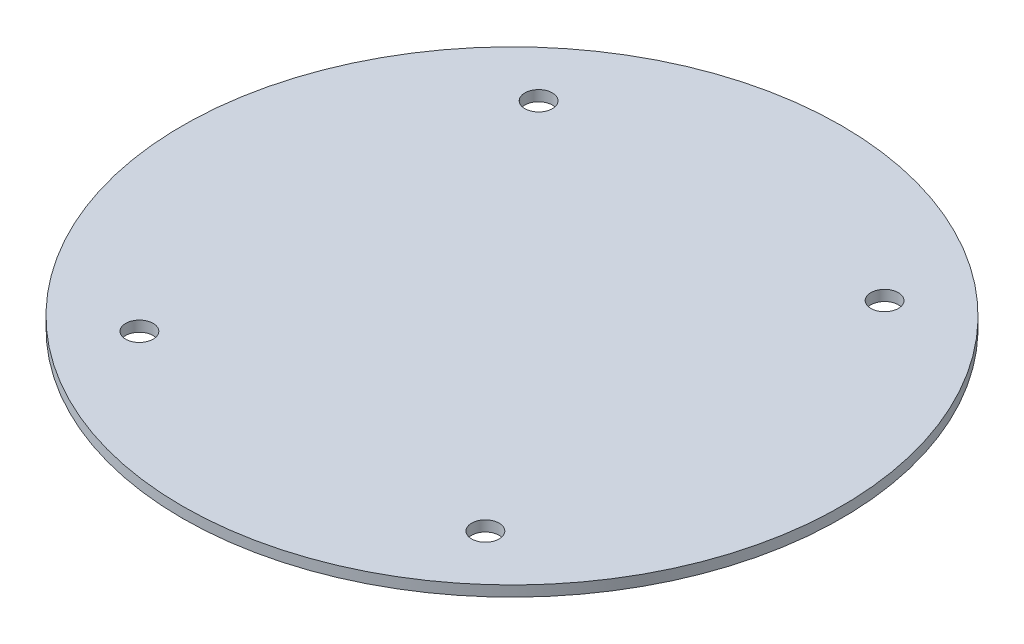
ISO-10303-21;
HEADER;
FILE_DESCRIPTION(('STEP AP214'),'2;1');
FILE_NAME('part.step','',(''),(''),'','','');
FILE_SCHEMA(('AUTOMOTIVE_DESIGN { 1 0 10303 214 1 1 1 1 }'));
ENDSEC;
DATA;
#1=APPLICATION_CONTEXT('core data for automotive mechanical design processes');
#2=APPLICATION_PROTOCOL_DEFINITION('international standard','automotive_design',2000,#1);
#3=PRODUCT_CONTEXT('',#1,'mechanical');
#4=PRODUCT('Part','Part','',(#3));
#5=PRODUCT_RELATED_PRODUCT_CATEGORY('part','',(#4));
#6=PRODUCT_DEFINITION_FORMATION('','',#4);
#7=PRODUCT_DEFINITION_CONTEXT('part definition',#1,'design');
#8=PRODUCT_DEFINITION('design','',#6,#7);
#9=PRODUCT_DEFINITION_SHAPE('','',#8);
#10=(LENGTH_UNIT() NAMED_UNIT(*) SI_UNIT(.MILLI.,.METRE.));
#11=(NAMED_UNIT(*) PLANE_ANGLE_UNIT() SI_UNIT($,.RADIAN.));
#12=(NAMED_UNIT(*) SI_UNIT($,.STERADIAN.) SOLID_ANGLE_UNIT());
#13=UNCERTAINTY_MEASURE_WITH_UNIT(LENGTH_MEASURE(1.E-05),#10,'distance_accuracy_value','');
#14=(GEOMETRIC_REPRESENTATION_CONTEXT(3) GLOBAL_UNCERTAINTY_ASSIGNED_CONTEXT((#13)) GLOBAL_UNIT_ASSIGNED_CONTEXT((#10,
#11,#12)) REPRESENTATION_CONTEXT('',''));
#15=CARTESIAN_POINT('',(0.,0.,0.));
#16=DIRECTION('',(0.,0.,1.));
#17=DIRECTION('',(1.,0.,0.));
#18=AXIS2_PLACEMENT_3D('',#15,#16,#17);
#19=CARTESIAN_POINT('',(0.,1.5875,0.));
#20=DIRECTION('',(0.,1.,0.));
#21=DIRECTION('',(0.,0.,1.));
#22=AXIS2_PLACEMENT_3D('',#19,#20,#21);
#23=PLANE('',#22);
#24=CARTESIAN_POINT('',(-26.,1.5875,-30.));
#25=DIRECTION('',(0.,-1.,0.));
#26=DIRECTION('',(0.,0.,1.));
#27=AXIS2_PLACEMENT_3D('',#24,#25,#26);
#28=CIRCLE('',#27,2.06375);
#29=CARTESIAN_POINT('',(-26.,1.5875,-27.93625));
#30=VERTEX_POINT('',#29);
#31=EDGE_CURVE('E54',#30,#30,#28,.T.);
#32=ORIENTED_EDGE('',*,*,#31,.T.);
#33=EDGE_LOOP('',(#32));
#34=FACE_BOUND('',#33,.T.);
#35=CARTESIAN_POINT('',(26.,1.5875,-30.));
#36=DIRECTION('',(0.,1.,0.));
#37=DIRECTION('',(0.,0.,1.));
#38=AXIS2_PLACEMENT_3D('',#35,#36,#37);
#39=CIRCLE('',#38,2.06375);
#40=CARTESIAN_POINT('',(26.,1.5875,-27.93625));
#41=VERTEX_POINT('',#40);
#42=EDGE_CURVE('E47',#41,#41,#39,.T.);
#43=ORIENTED_EDGE('',*,*,#42,.F.);
#44=EDGE_LOOP('',(#43));
#45=FACE_BOUND('',#44,.T.);
#46=CARTESIAN_POINT('',(0.,1.5875,0.));
#47=DIRECTION('',(0.,1.,0.));
#48=DIRECTION('',(0.,0.,1.));
#49=AXIS2_PLACEMENT_3D('',#46,#47,#48);
#50=CIRCLE('',#49,49.53);
#51=CARTESIAN_POINT('',(0.,1.5875,49.53));
#52=VERTEX_POINT('',#51);
#53=EDGE_CURVE('E10',#52,#52,#50,.T.);
#54=ORIENTED_EDGE('',*,*,#53,.T.);
#55=EDGE_LOOP('',(#54));
#56=FACE_BOUND('',#55,.T.);
#57=CARTESIAN_POINT('',(-26.,1.5875,30.));
#58=DIRECTION('',(0.,1.,0.));
#59=DIRECTION('',(0.,0.,-1.));
#60=AXIS2_PLACEMENT_3D('',#57,#58,#59);
#61=CIRCLE('',#60,2.06375);
#62=CARTESIAN_POINT('',(-26.,1.5875,27.93625));
#63=VERTEX_POINT('',#62);
#64=EDGE_CURVE('E57',#63,#63,#61,.T.);
#65=ORIENTED_EDGE('',*,*,#64,.F.);
#66=EDGE_LOOP('',(#65));
#67=FACE_BOUND('',#66,.T.);
#68=CARTESIAN_POINT('',(26.,1.5875,30.));
#69=DIRECTION('',(0.,-1.,0.));
#70=DIRECTION('',(0.,0.,-1.));
#71=AXIS2_PLACEMENT_3D('',#68,#69,#70);
#72=CIRCLE('',#71,2.06375);
#73=CARTESIAN_POINT('',(26.,1.5875,27.93625));
#74=VERTEX_POINT('',#73);
#75=EDGE_CURVE('E66',#74,#74,#72,.T.);
#76=ORIENTED_EDGE('',*,*,#75,.T.);
#77=EDGE_LOOP('',(#76));
#78=FACE_BOUND('',#77,.T.);
#79=ADVANCED_FACE('F31',(#34,#45,#56,#67,#78),#23,.T.);
#80=CARTESIAN_POINT('',(0.,0.,0.));
#81=DIRECTION('',(0.,1.,0.));
#82=DIRECTION('',(0.,0.,1.));
#83=AXIS2_PLACEMENT_3D('',#80,#81,#82);
#84=PLANE('',#83);
#85=CARTESIAN_POINT('',(-26.,0.,-30.));
#86=DIRECTION('',(0.,1.,0.));
#87=DIRECTION('',(0.,0.,1.));
#88=AXIS2_PLACEMENT_3D('',#85,#86,#87);
#89=CIRCLE('',#88,2.06375);
#90=CARTESIAN_POINT('',(-26.,0.,-27.93625));
#91=VERTEX_POINT('',#90);
#92=EDGE_CURVE('E52',#91,#91,#89,.F.);
#93=ORIENTED_EDGE('',*,*,#92,.F.);
#94=EDGE_LOOP('',(#93));
#95=FACE_BOUND('',#94,.T.);
#96=CARTESIAN_POINT('',(26.,0.,-30.));
#97=DIRECTION('',(0.,1.,0.));
#98=DIRECTION('',(0.,0.,1.));
#99=AXIS2_PLACEMENT_3D('',#96,#97,#98);
#100=CIRCLE('',#99,2.06375);
#101=CARTESIAN_POINT('',(26.,0.,-27.93625));
#102=VERTEX_POINT('',#101);
#103=EDGE_CURVE('E44',#102,#102,#100,.T.);
#104=ORIENTED_EDGE('',*,*,#103,.T.);
#105=EDGE_LOOP('',(#104));
#106=FACE_BOUND('',#105,.T.);
#107=CARTESIAN_POINT('',(0.,0.,0.));
#108=DIRECTION('',(0.,1.,0.));
#109=DIRECTION('',(0.,0.,1.));
#110=AXIS2_PLACEMENT_3D('',#107,#108,#109);
#111=CIRCLE('',#110,49.53);
#112=CARTESIAN_POINT('',(0.,0.,49.53));
#113=VERTEX_POINT('',#112);
#114=EDGE_CURVE('E39',#113,#113,#111,.T.);
#115=ORIENTED_EDGE('',*,*,#114,.F.);
#116=EDGE_LOOP('',(#115));
#117=FACE_BOUND('',#116,.T.);
#118=CARTESIAN_POINT('',(-26.,0.,30.));
#119=DIRECTION('',(0.,1.,0.));
#120=DIRECTION('',(0.,0.,1.));
#121=AXIS2_PLACEMENT_3D('',#118,#119,#120);
#122=CIRCLE('',#121,2.06375);
#123=CARTESIAN_POINT('',(-26.,0.,32.06375));
#124=VERTEX_POINT('',#123);
#125=EDGE_CURVE('E55',#124,#124,#122,.T.);
#126=ORIENTED_EDGE('',*,*,#125,.T.);
#127=EDGE_LOOP('',(#126));
#128=FACE_BOUND('',#127,.T.);
#129=CARTESIAN_POINT('',(26.,0.,30.));
#130=DIRECTION('',(0.,1.,0.));
#131=DIRECTION('',(0.,0.,1.));
#132=AXIS2_PLACEMENT_3D('',#129,#130,#131);
#133=CIRCLE('',#132,2.06375);
#134=CARTESIAN_POINT('',(26.,0.,32.06375));
#135=VERTEX_POINT('',#134);
#136=EDGE_CURVE('E35',#135,#135,#133,.F.);
#137=ORIENTED_EDGE('',*,*,#136,.F.);
#138=EDGE_LOOP('',(#137));
#139=FACE_BOUND('',#138,.T.);
#140=ADVANCED_FACE('F79',(#95,#106,#117,#128,#139),#84,.F.);
#141=CARTESIAN_POINT('',(0.,1.5875,0.));
#142=DIRECTION('',(0.,-1.,0.));
#143=DIRECTION('',(0.,0.,-1.));
#144=AXIS2_PLACEMENT_3D('',#141,#142,#143);
#145=CYLINDRICAL_SURFACE('',#144,49.53);
#146=ORIENTED_EDGE('',*,*,#53,.F.);
#147=EDGE_LOOP('',(#146));
#148=FACE_BOUND('',#147,.T.);
#149=ORIENTED_EDGE('',*,*,#114,.T.);
#150=EDGE_LOOP('',(#149));
#151=FACE_BOUND('',#150,.T.);
#152=ADVANCED_FACE('F33',(#148,#151),#145,.T.);
#153=CARTESIAN_POINT('',(26.,-8.4125,-30.));
#154=DIRECTION('',(0.,1.,0.));
#155=DIRECTION('',(0.,0.,1.));
#156=AXIS2_PLACEMENT_3D('',#153,#154,#155);
#157=CYLINDRICAL_SURFACE('',#156,2.06375);
#158=ORIENTED_EDGE('',*,*,#42,.T.);
#159=EDGE_LOOP('',(#158));
#160=FACE_BOUND('',#159,.T.);
#161=ORIENTED_EDGE('',*,*,#103,.F.);
#162=EDGE_LOOP('',(#161));
#163=FACE_BOUND('',#162,.T.);
#164=ADVANCED_FACE('F86',(#160,#163),#157,.F.);
#165=CARTESIAN_POINT('',(-26.,-8.4125,-30.));
#166=DIRECTION('',(0.,1.,0.));
#167=DIRECTION('',(0.,0.,1.));
#168=AXIS2_PLACEMENT_3D('',#165,#166,#167);
#169=CYLINDRICAL_SURFACE('',#168,2.06375);
#170=ORIENTED_EDGE('',*,*,#31,.F.);
#171=EDGE_LOOP('',(#170));
#172=FACE_BOUND('',#171,.T.);
#173=ORIENTED_EDGE('',*,*,#92,.T.);
#174=EDGE_LOOP('',(#173));
#175=FACE_BOUND('',#174,.T.);
#176=ADVANCED_FACE('F95',(#172,#175),#169,.F.);
#177=CARTESIAN_POINT('',(-26.,-8.4125,30.));
#178=DIRECTION('',(0.,1.,0.));
#179=DIRECTION('',(0.,0.,1.));
#180=AXIS2_PLACEMENT_3D('',#177,#178,#179);
#181=CYLINDRICAL_SURFACE('',#180,2.06375);
#182=ORIENTED_EDGE('',*,*,#64,.T.);
#183=EDGE_LOOP('',(#182));
#184=FACE_BOUND('',#183,.T.);
#185=ORIENTED_EDGE('',*,*,#125,.F.);
#186=EDGE_LOOP('',(#185));
#187=FACE_BOUND('',#186,.T.);
#188=ADVANCED_FACE('F75',(#184,#187),#181,.F.);
#189=CARTESIAN_POINT('',(26.,-8.4125,30.));
#190=DIRECTION('',(0.,1.,0.));
#191=DIRECTION('',(0.,0.,1.));
#192=AXIS2_PLACEMENT_3D('',#189,#190,#191);
#193=CYLINDRICAL_SURFACE('',#192,2.06375);
#194=ORIENTED_EDGE('',*,*,#75,.F.);
#195=EDGE_LOOP('',(#194));
#196=FACE_BOUND('',#195,.T.);
#197=ORIENTED_EDGE('',*,*,#136,.T.);
#198=EDGE_LOOP('',(#197));
#199=FACE_BOUND('',#198,.T.);
#200=ADVANCED_FACE('F72',(#196,#199),#193,.F.);
#201=CLOSED_SHELL('',(#79,#140,#152,#164,#176,#188,#200));
#202=MANIFOLD_SOLID_BREP('B2',#201);
#203=ADVANCED_BREP_SHAPE_REPRESENTATION('',(#18,#202),#14);
#204=SHAPE_DEFINITION_REPRESENTATION(#9,#203);
ENDSEC;
END-ISO-10303-21;
